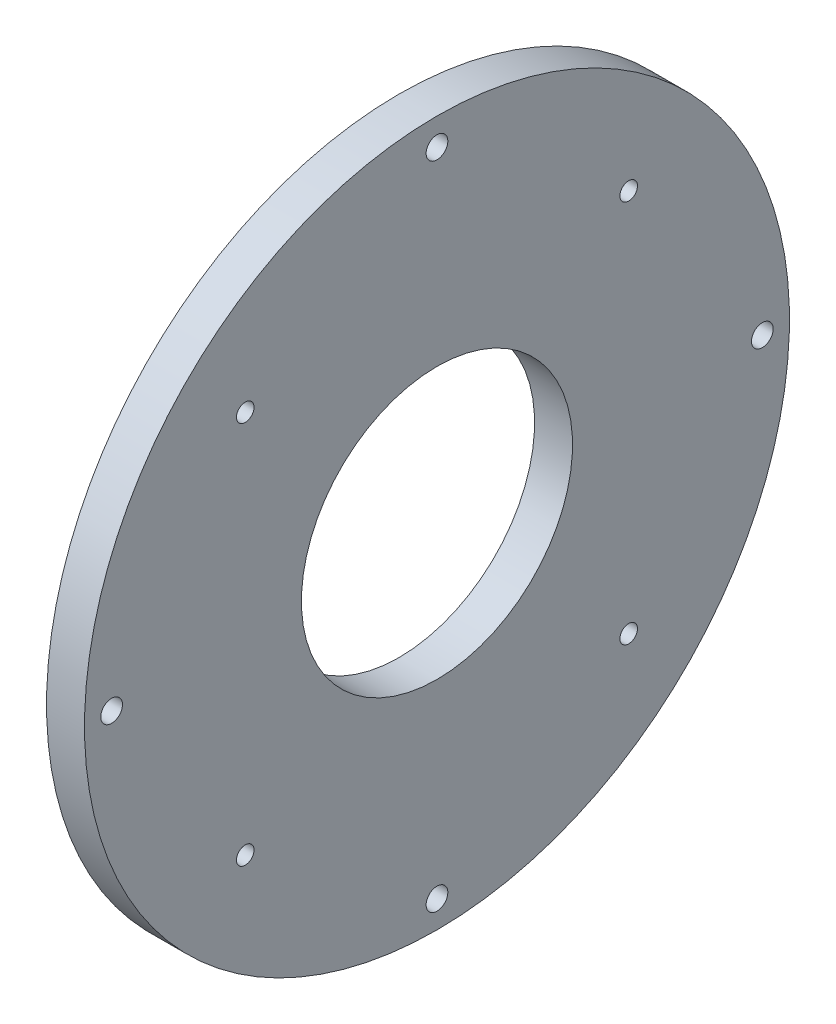
ISO-10303-21;
HEADER;
FILE_DESCRIPTION(('STEP AP214'),'2;1');
FILE_NAME('part.step','',(''),(''),'','','');
FILE_SCHEMA(('AUTOMOTIVE_DESIGN { 1 0 10303 214 1 1 1 1 }'));
ENDSEC;
DATA;
#1=APPLICATION_CONTEXT('core data for automotive mechanical design processes');
#2=APPLICATION_PROTOCOL_DEFINITION('international standard','automotive_design',2000,#1);
#3=PRODUCT_CONTEXT('',#1,'mechanical');
#4=PRODUCT('Part','Part','',(#3));
#5=PRODUCT_RELATED_PRODUCT_CATEGORY('part','',(#4));
#6=PRODUCT_DEFINITION_FORMATION('','',#4);
#7=PRODUCT_DEFINITION_CONTEXT('part definition',#1,'design');
#8=PRODUCT_DEFINITION('design','',#6,#7);
#9=PRODUCT_DEFINITION_SHAPE('','',#8);
#10=(LENGTH_UNIT() NAMED_UNIT(*) SI_UNIT(.MILLI.,.METRE.));
#11=(NAMED_UNIT(*) PLANE_ANGLE_UNIT() SI_UNIT($,.RADIAN.));
#12=(NAMED_UNIT(*) SI_UNIT($,.STERADIAN.) SOLID_ANGLE_UNIT());
#13=UNCERTAINTY_MEASURE_WITH_UNIT(LENGTH_MEASURE(1.E-05),#10,'distance_accuracy_value','');
#14=(GEOMETRIC_REPRESENTATION_CONTEXT(3) GLOBAL_UNCERTAINTY_ASSIGNED_CONTEXT((#13)) GLOBAL_UNIT_ASSIGNED_CONTEXT((#10,
#11,#12)) REPRESENTATION_CONTEXT('',''));
#15=CARTESIAN_POINT('',(0.,0.,0.));
#16=DIRECTION('',(0.,0.,1.));
#17=DIRECTION('',(1.,0.,0.));
#18=AXIS2_PLACEMENT_3D('',#15,#16,#17);
#19=CARTESIAN_POINT('',(0.,0.,0.));
#20=DIRECTION('',(1.,0.,0.));
#21=DIRECTION('',(0.,1.,0.));
#22=AXIS2_PLACEMENT_3D('',#19,#20,#21);
#23=PLANE('',#22);
#24=CARTESIAN_POINT('',(0.,0.,0.));
#25=DIRECTION('',(-1.,0.,0.));
#26=DIRECTION('',(0.,-1.,0.));
#27=AXIS2_PLACEMENT_3D('',#24,#25,#26);
#28=CIRCLE('',#27,25.);
#29=CARTESIAN_POINT('',(0.,25.,0.));
#30=VERTEX_POINT('',#29);
#31=EDGE_CURVE('E128',#30,#30,#28,.T.);
#32=ORIENTED_EDGE('',*,*,#31,.F.);
#33=EDGE_LOOP('',(#32));
#34=FACE_BOUND('',#33,.T.);
#35=CARTESIAN_POINT('',(0.,0.,60.));
#36=DIRECTION('',(1.,0.,0.));
#37=DIRECTION('',(0.,0.,-1.));
#38=AXIS2_PLACEMENT_3D('',#35,#36,#37);
#39=CIRCLE('',#38,2.);
#40=CARTESIAN_POINT('',(0.,0.,62.));
#41=VERTEX_POINT('',#40);
#42=EDGE_CURVE('E152',#41,#41,#39,.T.);
#43=ORIENTED_EDGE('',*,*,#42,.T.);
#44=EDGE_LOOP('',(#43));
#45=FACE_BOUND('',#44,.T.);
#46=CARTESIAN_POINT('',(0.,0.,-60.));
#47=DIRECTION('',(1.,0.,0.));
#48=DIRECTION('',(0.,0.,-1.));
#49=AXIS2_PLACEMENT_3D('',#46,#47,#48);
#50=CIRCLE('',#49,2.);
#51=CARTESIAN_POINT('',(0.,0.,-58.));
#52=VERTEX_POINT('',#51);
#53=EDGE_CURVE('E173',#52,#52,#50,.T.);
#54=ORIENTED_EDGE('',*,*,#53,.T.);
#55=EDGE_LOOP('',(#54));
#56=FACE_BOUND('',#55,.T.);
#57=CARTESIAN_POINT('',(0.,60.,0.));
#58=DIRECTION('',(1.,0.,0.));
#59=DIRECTION('',(0.,0.,-1.));
#60=AXIS2_PLACEMENT_3D('',#57,#58,#59);
#61=CIRCLE('',#60,2.);
#62=CARTESIAN_POINT('',(0.,60.,2.));
#63=VERTEX_POINT('',#62);
#64=EDGE_CURVE('E167',#63,#63,#61,.T.);
#65=ORIENTED_EDGE('',*,*,#64,.T.);
#66=EDGE_LOOP('',(#65));
#67=FACE_BOUND('',#66,.T.);
#68=CARTESIAN_POINT('',(0.,-60.,0.));
#69=DIRECTION('',(1.,0.,0.));
#70=DIRECTION('',(0.,0.,-1.));
#71=AXIS2_PLACEMENT_3D('',#68,#69,#70);
#72=CIRCLE('',#71,2.);
#73=CARTESIAN_POINT('',(0.,-60.,2.));
#74=VERTEX_POINT('',#73);
#75=EDGE_CURVE('E158',#74,#74,#72,.T.);
#76=ORIENTED_EDGE('',*,*,#75,.T.);
#77=EDGE_LOOP('',(#76));
#78=FACE_BOUND('',#77,.T.);
#79=CARTESIAN_POINT('',(0.,35.3553390593274,35.3553390593274));
#80=DIRECTION('',(1.,0.,0.));
#81=DIRECTION('',(0.,0.,-1.));
#82=AXIS2_PLACEMENT_3D('',#79,#80,#81);
#83=CIRCLE('',#82,1.621);
#84=CARTESIAN_POINT('',(0.,35.3553390593274,36.9763390593274));
#85=VERTEX_POINT('',#84);
#86=EDGE_CURVE('E163',#85,#85,#83,.T.);
#87=ORIENTED_EDGE('',*,*,#86,.T.);
#88=EDGE_LOOP('',(#87));
#89=FACE_BOUND('',#88,.T.);
#90=CARTESIAN_POINT('',(0.,-35.3553390593274,-35.3553390593274));
#91=DIRECTION('',(1.,0.,0.));
#92=DIRECTION('',(0.,0.,-1.));
#93=AXIS2_PLACEMENT_3D('',#90,#91,#92);
#94=CIRCLE('',#93,1.621);
#95=CARTESIAN_POINT('',(0.,-35.3553390593274,-33.7343390593274));
#96=VERTEX_POINT('',#95);
#97=EDGE_CURVE('E185',#96,#96,#94,.T.);
#98=ORIENTED_EDGE('',*,*,#97,.T.);
#99=EDGE_LOOP('',(#98));
#100=FACE_BOUND('',#99,.T.);
#101=CARTESIAN_POINT('',(0.,-35.3553390593274,35.3553390593274));
#102=DIRECTION('',(1.,0.,0.));
#103=DIRECTION('',(0.,0.,-1.));
#104=AXIS2_PLACEMENT_3D('',#101,#102,#103);
#105=CIRCLE('',#104,1.621);
#106=CARTESIAN_POINT('',(0.,-35.3553390593274,36.9763390593274));
#107=VERTEX_POINT('',#106);
#108=EDGE_CURVE('E92',#107,#107,#105,.T.);
#109=ORIENTED_EDGE('',*,*,#108,.T.);
#110=EDGE_LOOP('',(#109));
#111=FACE_BOUND('',#110,.T.);
#112=CARTESIAN_POINT('',(0.,35.3553390593274,-35.3553390593274));
#113=DIRECTION('',(1.,0.,0.));
#114=DIRECTION('',(0.,0.,-1.));
#115=AXIS2_PLACEMENT_3D('',#112,#113,#114);
#116=CIRCLE('',#115,1.621);
#117=CARTESIAN_POINT('',(0.,35.3553390593274,-33.7343390593274));
#118=VERTEX_POINT('',#117);
#119=EDGE_CURVE('E203',#118,#118,#116,.T.);
#120=ORIENTED_EDGE('',*,*,#119,.T.);
#121=EDGE_LOOP('',(#120));
#122=FACE_BOUND('',#121,.T.);
#123=CARTESIAN_POINT('',(0.,0.,0.));
#124=DIRECTION('',(1.,0.,0.));
#125=DIRECTION('',(0.,1.,0.));
#126=AXIS2_PLACEMENT_3D('',#123,#124,#125);
#127=CIRCLE('',#126,65.);
#128=CARTESIAN_POINT('',(0.,-65.,0.));
#129=VERTEX_POINT('',#128);
#130=EDGE_CURVE('E10',#129,#129,#127,.T.);
#131=ORIENTED_EDGE('',*,*,#130,.F.);
#132=EDGE_LOOP('',(#131));
#133=FACE_BOUND('',#132,.T.);
#134=ADVANCED_FACE('F16',(#34,#45,#56,#67,#78,#89,#100,#111,#122,#133),#23,.F.);
#135=CARTESIAN_POINT('',(7.,0.,0.));
#136=DIRECTION('',(1.,0.,0.));
#137=DIRECTION('',(0.,1.,0.));
#138=AXIS2_PLACEMENT_3D('',#135,#136,#137);
#139=PLANE('',#138);
#140=CARTESIAN_POINT('',(7.,0.,0.));
#141=DIRECTION('',(-1.,0.,0.));
#142=DIRECTION('',(0.,-1.,0.));
#143=AXIS2_PLACEMENT_3D('',#140,#141,#142);
#144=CIRCLE('',#143,25.);
#145=CARTESIAN_POINT('',(7.,25.,0.));
#146=VERTEX_POINT('',#145);
#147=EDGE_CURVE('E141',#146,#146,#144,.T.);
#148=ORIENTED_EDGE('',*,*,#147,.T.);
#149=EDGE_LOOP('',(#148));
#150=FACE_BOUND('',#149,.T.);
#151=CARTESIAN_POINT('',(7.,0.,60.));
#152=DIRECTION('',(-1.,0.,0.));
#153=DIRECTION('',(0.,0.,-1.));
#154=AXIS2_PLACEMENT_3D('',#151,#152,#153);
#155=CIRCLE('',#154,2.);
#156=CARTESIAN_POINT('',(7.,0.,62.));
#157=VERTEX_POINT('',#156);
#158=EDGE_CURVE('E168',#157,#157,#155,.T.);
#159=ORIENTED_EDGE('',*,*,#158,.T.);
#160=EDGE_LOOP('',(#159));
#161=FACE_BOUND('',#160,.T.);
#162=CARTESIAN_POINT('',(7.,0.,-60.));
#163=DIRECTION('',(-1.,0.,0.));
#164=DIRECTION('',(0.,0.,-1.));
#165=AXIS2_PLACEMENT_3D('',#162,#163,#164);
#166=CIRCLE('',#165,2.);
#167=CARTESIAN_POINT('',(7.,0.,-58.));
#168=VERTEX_POINT('',#167);
#169=EDGE_CURVE('E202',#168,#168,#166,.T.);
#170=ORIENTED_EDGE('',*,*,#169,.T.);
#171=EDGE_LOOP('',(#170));
#172=FACE_BOUND('',#171,.T.);
#173=CARTESIAN_POINT('',(7.,60.,0.));
#174=DIRECTION('',(-1.,0.,0.));
#175=DIRECTION('',(0.,0.,-1.));
#176=AXIS2_PLACEMENT_3D('',#173,#174,#175);
#177=CIRCLE('',#176,2.);
#178=CARTESIAN_POINT('',(7.,60.,2.));
#179=VERTEX_POINT('',#178);
#180=EDGE_CURVE('E153',#179,#179,#177,.T.);
#181=ORIENTED_EDGE('',*,*,#180,.T.);
#182=EDGE_LOOP('',(#181));
#183=FACE_BOUND('',#182,.T.);
#184=CARTESIAN_POINT('',(7.,-60.,0.));
#185=DIRECTION('',(-1.,0.,0.));
#186=DIRECTION('',(0.,0.,-1.));
#187=AXIS2_PLACEMENT_3D('',#184,#185,#186);
#188=CIRCLE('',#187,2.);
#189=CARTESIAN_POINT('',(7.,-60.,2.));
#190=VERTEX_POINT('',#189);
#191=EDGE_CURVE('E159',#190,#190,#188,.T.);
#192=ORIENTED_EDGE('',*,*,#191,.T.);
#193=EDGE_LOOP('',(#192));
#194=FACE_BOUND('',#193,.T.);
#195=CARTESIAN_POINT('',(7.,35.3553390593274,35.3553390593274));
#196=DIRECTION('',(-1.,0.,0.));
#197=DIRECTION('',(0.,0.,-1.));
#198=AXIS2_PLACEMENT_3D('',#195,#196,#197);
#199=CIRCLE('',#198,1.621);
#200=CARTESIAN_POINT('',(7.,35.3553390593274,36.9763390593274));
#201=VERTEX_POINT('',#200);
#202=EDGE_CURVE('E211',#201,#201,#199,.T.);
#203=ORIENTED_EDGE('',*,*,#202,.T.);
#204=EDGE_LOOP('',(#203));
#205=FACE_BOUND('',#204,.T.);
#206=CARTESIAN_POINT('',(7.,-35.3553390593274,-35.3553390593274));
#207=DIRECTION('',(-1.,0.,0.));
#208=DIRECTION('',(0.,0.,-1.));
#209=AXIS2_PLACEMENT_3D('',#206,#207,#208);
#210=CIRCLE('',#209,1.621);
#211=CARTESIAN_POINT('',(7.,-35.3553390593274,-33.7343390593274));
#212=VERTEX_POINT('',#211);
#213=EDGE_CURVE('E186',#212,#212,#210,.T.);
#214=ORIENTED_EDGE('',*,*,#213,.T.);
#215=EDGE_LOOP('',(#214));
#216=FACE_BOUND('',#215,.T.);
#217=CARTESIAN_POINT('',(7.,-35.3553390593274,35.3553390593274));
#218=DIRECTION('',(-1.,0.,0.));
#219=DIRECTION('',(0.,0.,-1.));
#220=AXIS2_PLACEMENT_3D('',#217,#218,#219);
#221=CIRCLE('',#220,1.621);
#222=CARTESIAN_POINT('',(7.,-35.3553390593274,36.9763390593274));
#223=VERTEX_POINT('',#222);
#224=EDGE_CURVE('E149',#223,#223,#221,.T.);
#225=ORIENTED_EDGE('',*,*,#224,.T.);
#226=EDGE_LOOP('',(#225));
#227=FACE_BOUND('',#226,.T.);
#228=CARTESIAN_POINT('',(7.,35.3553390593274,-35.3553390593274));
#229=DIRECTION('',(-1.,0.,0.));
#230=DIRECTION('',(0.,0.,-1.));
#231=AXIS2_PLACEMENT_3D('',#228,#229,#230);
#232=CIRCLE('',#231,1.621);
#233=CARTESIAN_POINT('',(7.,35.3553390593274,-33.7343390593274));
#234=VERTEX_POINT('',#233);
#235=EDGE_CURVE('E174',#234,#234,#232,.T.);
#236=ORIENTED_EDGE('',*,*,#235,.T.);
#237=EDGE_LOOP('',(#236));
#238=FACE_BOUND('',#237,.T.);
#239=CARTESIAN_POINT('',(7.,0.,0.));
#240=DIRECTION('',(1.,0.,0.));
#241=DIRECTION('',(0.,1.,0.));
#242=AXIS2_PLACEMENT_3D('',#239,#240,#241);
#243=CIRCLE('',#242,65.);
#244=CARTESIAN_POINT('',(7.,-65.,0.));
#245=VERTEX_POINT('',#244);
#246=EDGE_CURVE('E132',#245,#245,#243,.T.);
#247=ORIENTED_EDGE('',*,*,#246,.T.);
#248=EDGE_LOOP('',(#247));
#249=FACE_BOUND('',#248,.T.);
#250=ADVANCED_FACE('F241',(#150,#161,#172,#183,#194,#205,#216,#227,#238,#249),#139,.T.);
#251=CARTESIAN_POINT('',(0.,0.,0.));
#252=DIRECTION('',(1.,0.,0.));
#253=DIRECTION('',(0.,1.,0.));
#254=AXIS2_PLACEMENT_3D('',#251,#252,#253);
#255=CYLINDRICAL_SURFACE('',#254,65.);
#256=ORIENTED_EDGE('',*,*,#246,.F.);
#257=DIRECTION('',(-1.,0.,0.));
#258=VECTOR('',#257,1.);
#259=CARTESIAN_POINT('',(0.,-65.,0.));
#260=LINE('',#259,#258);
#261=EDGE_CURVE('E27',#245,#129,#260,.T.);
#262=ORIENTED_EDGE('',*,*,#261,.T.);
#263=ORIENTED_EDGE('',*,*,#130,.T.);
#264=ORIENTED_EDGE('',*,*,#261,.F.);
#265=EDGE_LOOP('',(#256,#262,#263,#264));
#266=FACE_BOUND('',#265,.T.);
#267=ADVANCED_FACE('F244',(#266),#255,.T.);
#268=CARTESIAN_POINT('',(0.,0.,0.));
#269=DIRECTION('',(1.,0.,0.));
#270=DIRECTION('',(0.,-1.,0.));
#271=AXIS2_PLACEMENT_3D('',#268,#269,#270);
#272=CYLINDRICAL_SURFACE('',#271,25.);
#273=ORIENTED_EDGE('',*,*,#147,.F.);
#274=DIRECTION('',(-1.,0.,0.));
#275=VECTOR('',#274,1.);
#276=CARTESIAN_POINT('',(0.,25.,0.));
#277=LINE('',#276,#275);
#278=EDGE_CURVE('E124',#146,#30,#277,.T.);
#279=ORIENTED_EDGE('',*,*,#278,.T.);
#280=ORIENTED_EDGE('',*,*,#31,.T.);
#281=ORIENTED_EDGE('',*,*,#278,.F.);
#282=EDGE_LOOP('',(#273,#279,#280,#281));
#283=FACE_BOUND('',#282,.T.);
#284=ADVANCED_FACE('F129',(#283),#272,.F.);
#285=CARTESIAN_POINT('',(-176.980977277544,0.,60.));
#286=DIRECTION('',(1.,0.,0.));
#287=DIRECTION('',(0.,0.,-1.));
#288=AXIS2_PLACEMENT_3D('',#285,#286,#287);
#289=CYLINDRICAL_SURFACE('',#288,2.);
#290=ORIENTED_EDGE('',*,*,#158,.F.);
#291=DIRECTION('',(-1.,0.,0.));
#292=VECTOR('',#291,1.);
#293=CARTESIAN_POINT('',(-176.980977277544,0.,62.));
#294=LINE('',#293,#292);
#295=EDGE_CURVE('E172',#157,#41,#294,.T.);
#296=ORIENTED_EDGE('',*,*,#295,.T.);
#297=ORIENTED_EDGE('',*,*,#42,.F.);
#298=ORIENTED_EDGE('',*,*,#295,.F.);
#299=EDGE_LOOP('',(#290,#296,#297,#298));
#300=FACE_BOUND('',#299,.T.);
#301=ADVANCED_FACE('F261',(#300),#289,.F.);
#302=CARTESIAN_POINT('',(-176.980977277544,0.,-60.));
#303=DIRECTION('',(1.,0.,0.));
#304=DIRECTION('',(0.,0.,-1.));
#305=AXIS2_PLACEMENT_3D('',#302,#303,#304);
#306=CYLINDRICAL_SURFACE('',#305,2.);
#307=ORIENTED_EDGE('',*,*,#169,.F.);
#308=DIRECTION('',(-1.,0.,0.));
#309=VECTOR('',#308,1.);
#310=CARTESIAN_POINT('',(-176.980977277544,0.,-58.));
#311=LINE('',#310,#309);
#312=EDGE_CURVE('E189',#168,#52,#311,.T.);
#313=ORIENTED_EDGE('',*,*,#312,.T.);
#314=ORIENTED_EDGE('',*,*,#53,.F.);
#315=ORIENTED_EDGE('',*,*,#312,.F.);
#316=EDGE_LOOP('',(#307,#313,#314,#315));
#317=FACE_BOUND('',#316,.T.);
#318=ADVANCED_FACE('F363',(#317),#306,.F.);
#319=CARTESIAN_POINT('',(-176.980977277544,60.,0.));
#320=DIRECTION('',(1.,0.,0.));
#321=DIRECTION('',(0.,0.,-1.));
#322=AXIS2_PLACEMENT_3D('',#319,#320,#321);
#323=CYLINDRICAL_SURFACE('',#322,2.);
#324=ORIENTED_EDGE('',*,*,#180,.F.);
#325=DIRECTION('',(-1.,0.,0.));
#326=VECTOR('',#325,1.);
#327=CARTESIAN_POINT('',(-176.980977277544,60.,2.));
#328=LINE('',#327,#326);
#329=EDGE_CURVE('E157',#179,#63,#328,.T.);
#330=ORIENTED_EDGE('',*,*,#329,.T.);
#331=ORIENTED_EDGE('',*,*,#64,.F.);
#332=ORIENTED_EDGE('',*,*,#329,.F.);
#333=EDGE_LOOP('',(#324,#330,#331,#332));
#334=FACE_BOUND('',#333,.T.);
#335=ADVANCED_FACE('F239',(#334),#323,.F.);
#336=CARTESIAN_POINT('',(-176.980977277544,-60.,0.));
#337=DIRECTION('',(1.,0.,0.));
#338=DIRECTION('',(0.,0.,-1.));
#339=AXIS2_PLACEMENT_3D('',#336,#337,#338);
#340=CYLINDRICAL_SURFACE('',#339,2.);
#341=ORIENTED_EDGE('',*,*,#191,.F.);
#342=DIRECTION('',(-1.,0.,0.));
#343=VECTOR('',#342,1.);
#344=CARTESIAN_POINT('',(-176.980977277544,-60.,2.));
#345=LINE('',#344,#343);
#346=EDGE_CURVE('E20',#190,#74,#345,.T.);
#347=ORIENTED_EDGE('',*,*,#346,.T.);
#348=ORIENTED_EDGE('',*,*,#75,.F.);
#349=ORIENTED_EDGE('',*,*,#346,.F.);
#350=EDGE_LOOP('',(#341,#347,#348,#349));
#351=FACE_BOUND('',#350,.T.);
#352=ADVANCED_FACE('F344',(#351),#340,.F.);
#353=CARTESIAN_POINT('',(-176.980977277544,35.3553390593274,35.3553390593274));
#354=DIRECTION('',(1.,0.,0.));
#355=DIRECTION('',(0.,0.,-1.));
#356=AXIS2_PLACEMENT_3D('',#353,#354,#355);
#357=CYLINDRICAL_SURFACE('',#356,1.621);
#358=ORIENTED_EDGE('',*,*,#202,.F.);
#359=DIRECTION('',(-1.,0.,0.));
#360=VECTOR('',#359,1.);
#361=CARTESIAN_POINT('',(-176.980977277544,35.3553390593274,36.9763390593274));
#362=LINE('',#361,#360);
#363=EDGE_CURVE('E180',#201,#85,#362,.T.);
#364=ORIENTED_EDGE('',*,*,#363,.T.);
#365=ORIENTED_EDGE('',*,*,#86,.F.);
#366=ORIENTED_EDGE('',*,*,#363,.F.);
#367=EDGE_LOOP('',(#358,#364,#365,#366));
#368=FACE_BOUND('',#367,.T.);
#369=ADVANCED_FACE('F350',(#368),#357,.F.);
#370=CARTESIAN_POINT('',(-176.980977277544,-35.3553390593274,-35.3553390593274));
#371=DIRECTION('',(1.,0.,0.));
#372=DIRECTION('',(0.,0.,-1.));
#373=AXIS2_PLACEMENT_3D('',#370,#371,#372);
#374=CYLINDRICAL_SURFACE('',#373,1.621);
#375=ORIENTED_EDGE('',*,*,#213,.F.);
#376=DIRECTION('',(-1.,0.,0.));
#377=VECTOR('',#376,1.);
#378=CARTESIAN_POINT('',(-176.980977277544,-35.3553390593274,-33.7343390593274));
#379=LINE('',#378,#377);
#380=EDGE_CURVE('E181',#212,#96,#379,.T.);
#381=ORIENTED_EDGE('',*,*,#380,.T.);
#382=ORIENTED_EDGE('',*,*,#97,.F.);
#383=ORIENTED_EDGE('',*,*,#380,.F.);
#384=EDGE_LOOP('',(#375,#381,#382,#383));
#385=FACE_BOUND('',#384,.T.);
#386=ADVANCED_FACE('F18',(#385),#374,.F.);
#387=CARTESIAN_POINT('',(-176.980977277544,-35.3553390593274,35.3553390593274));
#388=DIRECTION('',(1.,0.,0.));
#389=DIRECTION('',(0.,0.,-1.));
#390=AXIS2_PLACEMENT_3D('',#387,#388,#389);
#391=CYLINDRICAL_SURFACE('',#390,1.621);
#392=ORIENTED_EDGE('',*,*,#224,.F.);
#393=DIRECTION('',(-1.,0.,0.));
#394=VECTOR('',#393,1.);
#395=CARTESIAN_POINT('',(-176.980977277544,-35.3553390593274,36.9763390593274));
#396=LINE('',#395,#394);
#397=EDGE_CURVE('E103',#223,#107,#396,.T.);
#398=ORIENTED_EDGE('',*,*,#397,.T.);
#399=ORIENTED_EDGE('',*,*,#108,.F.);
#400=ORIENTED_EDGE('',*,*,#397,.F.);
#401=EDGE_LOOP('',(#392,#398,#399,#400));
#402=FACE_BOUND('',#401,.T.);
#403=ADVANCED_FACE('F270',(#402),#391,.F.);
#404=CARTESIAN_POINT('',(-176.980977277544,35.3553390593274,-35.3553390593274));
#405=DIRECTION('',(1.,0.,0.));
#406=DIRECTION('',(0.,0.,-1.));
#407=AXIS2_PLACEMENT_3D('',#404,#405,#406);
#408=CYLINDRICAL_SURFACE('',#407,1.621);
#409=ORIENTED_EDGE('',*,*,#235,.F.);
#410=DIRECTION('',(-1.,0.,0.));
#411=VECTOR('',#410,1.);
#412=CARTESIAN_POINT('',(-176.980977277544,35.3553390593274,-33.7343390593274));
#413=LINE('',#412,#411);
#414=EDGE_CURVE('E144',#234,#118,#413,.T.);
#415=ORIENTED_EDGE('',*,*,#414,.T.);
#416=ORIENTED_EDGE('',*,*,#119,.F.);
#417=ORIENTED_EDGE('',*,*,#414,.F.);
#418=EDGE_LOOP('',(#409,#415,#416,#417));
#419=FACE_BOUND('',#418,.T.);
#420=ADVANCED_FACE('F268',(#419),#408,.F.);
#421=CLOSED_SHELL('',(#134,#250,#267,#284,#301,#318,#335,#352,#369,#386,#403,#420));
#422=MANIFOLD_SOLID_BREP('B1',#421);
#423=ADVANCED_BREP_SHAPE_REPRESENTATION('',(#18,#422),#14);
#424=SHAPE_DEFINITION_REPRESENTATION(#9,#423);
ENDSEC;
END-ISO-10303-21;
